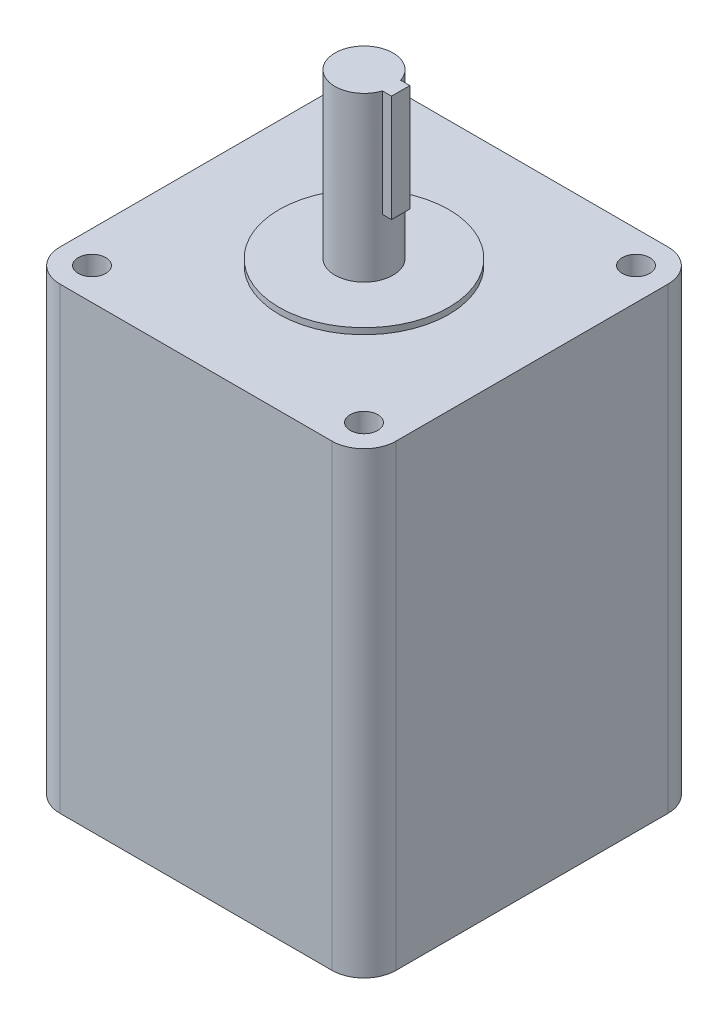
ISO-10303-21;
HEADER;
FILE_DESCRIPTION(('STEP AP214'),'2;1');
FILE_NAME('part.step','',(''),(''),'','','');
FILE_SCHEMA(('AUTOMOTIVE_DESIGN { 1 0 10303 214 1 1 1 1 }'));
ENDSEC;
DATA;
#1=APPLICATION_CONTEXT('core data for automotive mechanical design processes');
#2=APPLICATION_PROTOCOL_DEFINITION('international standard','automotive_design',2000,#1);
#3=PRODUCT_CONTEXT('',#1,'mechanical');
#4=PRODUCT('Part','Part','',(#3));
#5=PRODUCT_RELATED_PRODUCT_CATEGORY('part','',(#4));
#6=PRODUCT_DEFINITION_FORMATION('','',#4);
#7=PRODUCT_DEFINITION_CONTEXT('part definition',#1,'design');
#8=PRODUCT_DEFINITION('design','',#6,#7);
#9=PRODUCT_DEFINITION_SHAPE('','',#8);
#10=(LENGTH_UNIT() NAMED_UNIT(*) SI_UNIT(.MILLI.,.METRE.));
#11=(NAMED_UNIT(*) PLANE_ANGLE_UNIT() SI_UNIT($,.RADIAN.));
#12=(NAMED_UNIT(*) SI_UNIT($,.STERADIAN.) SOLID_ANGLE_UNIT());
#13=UNCERTAINTY_MEASURE_WITH_UNIT(LENGTH_MEASURE(1.E-05),#10,'distance_accuracy_value','');
#14=(GEOMETRIC_REPRESENTATION_CONTEXT(3) GLOBAL_UNCERTAINTY_ASSIGNED_CONTEXT((#13)) GLOBAL_UNIT_ASSIGNED_CONTEXT((#10,
#11,#12)) REPRESENTATION_CONTEXT('',''));
#15=CARTESIAN_POINT('',(0.,0.,0.));
#16=DIRECTION('',(0.,0.,1.));
#17=DIRECTION('',(1.,0.,0.));
#18=AXIS2_PLACEMENT_3D('',#15,#16,#17);
#19=CARTESIAN_POINT('',(0.,205.5,0.));
#20=DIRECTION('',(0.,-1.,0.));
#21=DIRECTION('',(0.,0.,-1.));
#22=AXIS2_PLACEMENT_3D('',#19,#20,#21);
#23=CYLINDRICAL_SURFACE('',#22,9.5);
#24=CARTESIAN_POINT('',(0.,152.,0.));
#25=DIRECTION('',(0.,1.,0.));
#26=DIRECTION('',(0.,0.,1.));
#27=AXIS2_PLACEMENT_3D('',#24,#25,#26);
#28=CIRCLE('',#27,9.5);
#29=CARTESIAN_POINT('',(0.,152.,9.5));
#30=VERTEX_POINT('',#29);
#31=EDGE_CURVE('E191',#30,#30,#28,.T.);
#32=ORIENTED_EDGE('',*,*,#31,.T.);
#33=EDGE_LOOP('',(#32));
#34=FACE_BOUND('',#33,.T.);
#35=DIRECTION('',(0.,-1.,0.));
#36=VECTOR('',#35,1.);
#37=CARTESIAN_POINT('',(9.01387818865997,205.5,3.));
#38=LINE('',#37,#36);
#39=CARTESIAN_POINT('',(9.01387818865997,205.5,3.));
#40=VERTEX_POINT('',#39);
#41=CARTESIAN_POINT('',(9.01387818865997,170.5,3.));
#42=VERTEX_POINT('',#41);
#43=EDGE_CURVE('E11',#40,#42,#38,.T.);
#44=ORIENTED_EDGE('',*,*,#43,.F.);
#45=CARTESIAN_POINT('',(0.,205.5,0.));
#46=DIRECTION('',(0.,1.,0.));
#47=DIRECTION('',(0.,0.,1.));
#48=AXIS2_PLACEMENT_3D('',#45,#46,#47);
#49=CIRCLE('',#48,9.5);
#50=CARTESIAN_POINT('',(9.01387818865997,205.5,-3.));
#51=VERTEX_POINT('',#50);
#52=EDGE_CURVE('E194',#51,#40,#49,.T.);
#53=ORIENTED_EDGE('',*,*,#52,.F.);
#54=DIRECTION('',(0.,-1.,0.));
#55=VECTOR('',#54,1.);
#56=CARTESIAN_POINT('',(9.01387818865997,205.5,-3.));
#57=LINE('',#56,#55);
#58=CARTESIAN_POINT('',(9.01387818865997,170.5,-3.));
#59=VERTEX_POINT('',#58);
#60=EDGE_CURVE('E190',#59,#51,#57,.F.);
#61=ORIENTED_EDGE('',*,*,#60,.F.);
#62=CARTESIAN_POINT('',(0.,170.5,0.));
#63=DIRECTION('',(0.,1.,0.));
#64=DIRECTION('',(0.,0.,1.));
#65=AXIS2_PLACEMENT_3D('',#62,#63,#64);
#66=CIRCLE('',#65,9.5);
#67=EDGE_CURVE('E53',#42,#59,#66,.T.);
#68=ORIENTED_EDGE('',*,*,#67,.F.);
#69=EDGE_LOOP('',(#44,#53,#61,#68));
#70=FACE_BOUND('',#69,.T.);
#71=ADVANCED_FACE('F45',(#34,#70),#23,.T.);
#72=CARTESIAN_POINT('',(-44.5,150.,-44.5));
#73=DIRECTION('',(0.,-1.,0.));
#74=DIRECTION('',(0.,0.,-1.));
#75=AXIS2_PLACEMENT_3D('',#72,#73,#74);
#76=CYLINDRICAL_SURFACE('',#75,10.5);
#77=CARTESIAN_POINT('',(-44.5,0.,-44.5));
#78=DIRECTION('',(0.,1.,0.));
#79=DIRECTION('',(0.,0.,1.));
#80=AXIS2_PLACEMENT_3D('',#77,#78,#79);
#81=CIRCLE('',#80,10.5);
#82=CARTESIAN_POINT('',(-44.5,0.,-55.));
#83=VERTEX_POINT('',#82);
#84=CARTESIAN_POINT('',(-55.,0.,-44.5));
#85=VERTEX_POINT('',#84);
#86=EDGE_CURVE('E157',#83,#85,#81,.T.);
#87=ORIENTED_EDGE('',*,*,#86,.T.);
#88=DIRECTION('',(0.,-1.,0.));
#89=VECTOR('',#88,1.);
#90=CARTESIAN_POINT('',(-55.,150.,-44.5));
#91=LINE('',#90,#89);
#92=CARTESIAN_POINT('',(-55.,150.,-44.5));
#93=VERTEX_POINT('',#92);
#94=EDGE_CURVE('E188',#93,#85,#91,.T.);
#95=ORIENTED_EDGE('',*,*,#94,.F.);
#96=CARTESIAN_POINT('',(-44.5,150.,-44.5));
#97=DIRECTION('',(0.,1.,0.));
#98=DIRECTION('',(0.,0.,1.));
#99=AXIS2_PLACEMENT_3D('',#96,#97,#98);
#100=CIRCLE('',#99,10.5);
#101=CARTESIAN_POINT('',(-44.5,150.,-55.));
#102=VERTEX_POINT('',#101);
#103=EDGE_CURVE('E178',#102,#93,#100,.T.);
#104=ORIENTED_EDGE('',*,*,#103,.F.);
#105=DIRECTION('',(0.,-1.,0.));
#106=VECTOR('',#105,1.);
#107=CARTESIAN_POINT('',(-44.5,150.,-55.));
#108=LINE('',#107,#106);
#109=EDGE_CURVE('E69',#102,#83,#108,.T.);
#110=ORIENTED_EDGE('',*,*,#109,.T.);
#111=EDGE_LOOP('',(#87,#95,#104,#110));
#112=FACE_BOUND('',#111,.T.);
#113=ADVANCED_FACE('F47',(#112),#76,.T.);
#114=CARTESIAN_POINT('',(-55.,150.,-44.5));
#115=DIRECTION('',(1.,0.,0.));
#116=DIRECTION('',(0.,0.,-1.));
#117=AXIS2_PLACEMENT_3D('',#114,#115,#116);
#118=PLANE('',#117);
#119=DIRECTION('',(0.,0.,1.));
#120=VECTOR('',#119,1.);
#121=CARTESIAN_POINT('',(-55.,0.,-44.5));
#122=LINE('',#121,#120);
#123=CARTESIAN_POINT('',(-55.,0.,44.5));
#124=VERTEX_POINT('',#123);
#125=EDGE_CURVE('E159',#85,#124,#122,.T.);
#126=ORIENTED_EDGE('',*,*,#125,.T.);
#127=DIRECTION('',(0.,-1.,0.));
#128=VECTOR('',#127,1.);
#129=CARTESIAN_POINT('',(-55.,150.,44.5));
#130=LINE('',#129,#128);
#131=CARTESIAN_POINT('',(-55.,150.,44.5));
#132=VERTEX_POINT('',#131);
#133=EDGE_CURVE('E186',#132,#124,#130,.T.);
#134=ORIENTED_EDGE('',*,*,#133,.F.);
#135=DIRECTION('',(0.,0.,1.));
#136=VECTOR('',#135,1.);
#137=CARTESIAN_POINT('',(-55.,150.,-44.5));
#138=LINE('',#137,#136);
#139=EDGE_CURVE('E109',#93,#132,#138,.T.);
#140=ORIENTED_EDGE('',*,*,#139,.F.);
#141=ORIENTED_EDGE('',*,*,#94,.T.);
#142=EDGE_LOOP('',(#126,#134,#140,#141));
#143=FACE_BOUND('',#142,.T.);
#144=ADVANCED_FACE('F266',(#143),#118,.F.);
#145=CARTESIAN_POINT('',(-44.5,150.,44.5));
#146=DIRECTION('',(0.,-1.,0.));
#147=DIRECTION('',(0.,0.,-1.));
#148=AXIS2_PLACEMENT_3D('',#145,#146,#147);
#149=CYLINDRICAL_SURFACE('',#148,10.5);
#150=CARTESIAN_POINT('',(-44.5,0.,44.5));
#151=DIRECTION('',(0.,-1.,0.));
#152=DIRECTION('',(0.,0.,-1.));
#153=AXIS2_PLACEMENT_3D('',#150,#151,#152);
#154=CIRCLE('',#153,10.5);
#155=CARTESIAN_POINT('',(-44.5,0.,55.));
#156=VERTEX_POINT('',#155);
#157=EDGE_CURVE('E163',#156,#124,#154,.T.);
#158=ORIENTED_EDGE('',*,*,#157,.F.);
#159=DIRECTION('',(0.,-1.,0.));
#160=VECTOR('',#159,1.);
#161=CARTESIAN_POINT('',(-44.5,150.,55.));
#162=LINE('',#161,#160);
#163=CARTESIAN_POINT('',(-44.5,150.,55.));
#164=VERTEX_POINT('',#163);
#165=EDGE_CURVE('E184',#164,#156,#162,.T.);
#166=ORIENTED_EDGE('',*,*,#165,.F.);
#167=CARTESIAN_POINT('',(-44.5,150.,44.5));
#168=DIRECTION('',(0.,-1.,0.));
#169=DIRECTION('',(0.,0.,-1.));
#170=AXIS2_PLACEMENT_3D('',#167,#168,#169);
#171=CIRCLE('',#170,10.5);
#172=EDGE_CURVE('E251',#164,#132,#171,.T.);
#173=ORIENTED_EDGE('',*,*,#172,.T.);
#174=ORIENTED_EDGE('',*,*,#133,.T.);
#175=EDGE_LOOP('',(#158,#166,#173,#174));
#176=FACE_BOUND('',#175,.T.);
#177=ADVANCED_FACE('F269',(#176),#149,.T.);
#178=CARTESIAN_POINT('',(-44.5,150.,55.));
#179=DIRECTION('',(0.,0.,-1.));
#180=DIRECTION('',(-1.,0.,0.));
#181=AXIS2_PLACEMENT_3D('',#178,#179,#180);
#182=PLANE('',#181);
#183=DIRECTION('',(1.,0.,0.));
#184=VECTOR('',#183,1.);
#185=CARTESIAN_POINT('',(-44.5,0.,55.));
#186=LINE('',#185,#184);
#187=CARTESIAN_POINT('',(44.5,0.,55.));
#188=VERTEX_POINT('',#187);
#189=EDGE_CURVE('E166',#156,#188,#186,.T.);
#190=ORIENTED_EDGE('',*,*,#189,.T.);
#191=DIRECTION('',(0.,-1.,0.));
#192=VECTOR('',#191,1.);
#193=CARTESIAN_POINT('',(44.5,150.,55.));
#194=LINE('',#193,#192);
#195=CARTESIAN_POINT('',(44.5,150.,55.));
#196=VERTEX_POINT('',#195);
#197=EDGE_CURVE('E182',#196,#188,#194,.T.);
#198=ORIENTED_EDGE('',*,*,#197,.F.);
#199=DIRECTION('',(1.,0.,0.));
#200=VECTOR('',#199,1.);
#201=CARTESIAN_POINT('',(-44.5,150.,55.));
#202=LINE('',#201,#200);
#203=EDGE_CURVE('E152',#164,#196,#202,.T.);
#204=ORIENTED_EDGE('',*,*,#203,.F.);
#205=ORIENTED_EDGE('',*,*,#165,.T.);
#206=EDGE_LOOP('',(#190,#198,#204,#205));
#207=FACE_BOUND('',#206,.T.);
#208=ADVANCED_FACE('F257',(#207),#182,.F.);
#209=CARTESIAN_POINT('',(44.5,150.,44.5));
#210=DIRECTION('',(0.,-1.,0.));
#211=DIRECTION('',(0.,0.,-1.));
#212=AXIS2_PLACEMENT_3D('',#209,#210,#211);
#213=CYLINDRICAL_SURFACE('',#212,10.5);
#214=CARTESIAN_POINT('',(44.5,0.,44.5));
#215=DIRECTION('',(0.,-1.,0.));
#216=DIRECTION('',(0.,0.,-1.));
#217=AXIS2_PLACEMENT_3D('',#214,#215,#216);
#218=CIRCLE('',#217,10.5);
#219=CARTESIAN_POINT('',(55.,0.,44.5));
#220=VERTEX_POINT('',#219);
#221=EDGE_CURVE('E169',#220,#188,#218,.T.);
#222=ORIENTED_EDGE('',*,*,#221,.F.);
#223=DIRECTION('',(0.,-1.,0.));
#224=VECTOR('',#223,1.);
#225=CARTESIAN_POINT('',(55.,150.,44.5));
#226=LINE('',#225,#224);
#227=CARTESIAN_POINT('',(55.,150.,44.5));
#228=VERTEX_POINT('',#227);
#229=EDGE_CURVE('E137',#228,#220,#226,.T.);
#230=ORIENTED_EDGE('',*,*,#229,.F.);
#231=CARTESIAN_POINT('',(44.5,150.,44.5));
#232=DIRECTION('',(0.,-1.,0.));
#233=DIRECTION('',(0.,0.,-1.));
#234=AXIS2_PLACEMENT_3D('',#231,#232,#233);
#235=CIRCLE('',#234,10.5);
#236=EDGE_CURVE('E150',#228,#196,#235,.T.);
#237=ORIENTED_EDGE('',*,*,#236,.T.);
#238=ORIENTED_EDGE('',*,*,#197,.T.);
#239=EDGE_LOOP('',(#222,#230,#237,#238));
#240=FACE_BOUND('',#239,.T.);
#241=ADVANCED_FACE('F261',(#240),#213,.T.);
#242=CARTESIAN_POINT('',(55.,150.,-44.5));
#243=DIRECTION('',(1.,0.,0.));
#244=DIRECTION('',(0.,0.,-1.));
#245=AXIS2_PLACEMENT_3D('',#242,#243,#244);
#246=PLANE('',#245);
#247=DIRECTION('',(0.,0.,1.));
#248=VECTOR('',#247,1.);
#249=CARTESIAN_POINT('',(55.,0.,-44.5));
#250=LINE('',#249,#248);
#251=CARTESIAN_POINT('',(55.,0.,-44.5));
#252=VERTEX_POINT('',#251);
#253=EDGE_CURVE('E133',#252,#220,#250,.T.);
#254=ORIENTED_EDGE('',*,*,#253,.F.);
#255=DIRECTION('',(0.,-1.,0.));
#256=VECTOR('',#255,1.);
#257=CARTESIAN_POINT('',(55.,150.,-44.5));
#258=LINE('',#257,#256);
#259=CARTESIAN_POINT('',(55.,150.,-44.5));
#260=VERTEX_POINT('',#259);
#261=EDGE_CURVE('E127',#260,#252,#258,.T.);
#262=ORIENTED_EDGE('',*,*,#261,.F.);
#263=DIRECTION('',(0.,0.,1.));
#264=VECTOR('',#263,1.);
#265=CARTESIAN_POINT('',(55.,150.,-44.5));
#266=LINE('',#265,#264);
#267=EDGE_CURVE('E131',#260,#228,#266,.T.);
#268=ORIENTED_EDGE('',*,*,#267,.T.);
#269=ORIENTED_EDGE('',*,*,#229,.T.);
#270=EDGE_LOOP('',(#254,#262,#268,#269));
#271=FACE_BOUND('',#270,.T.);
#272=ADVANCED_FACE('F129',(#271),#246,.T.);
#273=CARTESIAN_POINT('',(44.5,150.,-44.5));
#274=DIRECTION('',(0.,-1.,0.));
#275=DIRECTION('',(0.,0.,-1.));
#276=AXIS2_PLACEMENT_3D('',#273,#274,#275);
#277=CYLINDRICAL_SURFACE('',#276,10.5);
#278=CARTESIAN_POINT('',(44.5,0.,-44.5));
#279=DIRECTION('',(0.,1.,0.));
#280=DIRECTION('',(0.,0.,1.));
#281=AXIS2_PLACEMENT_3D('',#278,#279,#280);
#282=CIRCLE('',#281,10.5);
#283=CARTESIAN_POINT('',(44.5,0.,-55.));
#284=VERTEX_POINT('',#283);
#285=EDGE_CURVE('E173',#252,#284,#282,.T.);
#286=ORIENTED_EDGE('',*,*,#285,.T.);
#287=DIRECTION('',(0.,-1.,0.));
#288=VECTOR('',#287,1.);
#289=CARTESIAN_POINT('',(44.5,150.,-55.));
#290=LINE('',#289,#288);
#291=CARTESIAN_POINT('',(44.5,150.,-55.));
#292=VERTEX_POINT('',#291);
#293=EDGE_CURVE('E138',#292,#284,#290,.T.);
#294=ORIENTED_EDGE('',*,*,#293,.F.);
#295=CARTESIAN_POINT('',(44.5,150.,-44.5));
#296=DIRECTION('',(0.,1.,0.));
#297=DIRECTION('',(0.,0.,1.));
#298=AXIS2_PLACEMENT_3D('',#295,#296,#297);
#299=CIRCLE('',#298,10.5);
#300=EDGE_CURVE('E141',#260,#292,#299,.T.);
#301=ORIENTED_EDGE('',*,*,#300,.F.);
#302=ORIENTED_EDGE('',*,*,#261,.T.);
#303=EDGE_LOOP('',(#286,#294,#301,#302));
#304=FACE_BOUND('',#303,.T.);
#305=ADVANCED_FACE('F142',(#304),#277,.T.);
#306=CARTESIAN_POINT('',(-44.5,150.,-55.));
#307=DIRECTION('',(0.,0.,-1.));
#308=DIRECTION('',(-1.,0.,0.));
#309=AXIS2_PLACEMENT_3D('',#306,#307,#308);
#310=PLANE('',#309);
#311=DIRECTION('',(1.,0.,0.));
#312=VECTOR('',#311,1.);
#313=CARTESIAN_POINT('',(-44.5,0.,-55.));
#314=LINE('',#313,#312);
#315=EDGE_CURVE('E175',#83,#284,#314,.T.);
#316=ORIENTED_EDGE('',*,*,#315,.F.);
#317=ORIENTED_EDGE('',*,*,#109,.F.);
#318=DIRECTION('',(1.,0.,0.));
#319=VECTOR('',#318,1.);
#320=CARTESIAN_POINT('',(-44.5,150.,-55.));
#321=LINE('',#320,#319);
#322=EDGE_CURVE('E145',#102,#292,#321,.T.);
#323=ORIENTED_EDGE('',*,*,#322,.T.);
#324=ORIENTED_EDGE('',*,*,#293,.T.);
#325=EDGE_LOOP('',(#316,#317,#323,#324));
#326=FACE_BOUND('',#325,.T.);
#327=ADVANCED_FACE('F264',(#326),#310,.T.);
#328=CARTESIAN_POINT('',(-44.5,150.,-44.5));
#329=DIRECTION('',(0.,1.,0.));
#330=DIRECTION('',(0.,0.,1.));
#331=AXIS2_PLACEMENT_3D('',#328,#329,#330);
#332=PLANE('',#331);
#333=CARTESIAN_POINT('',(0.,150.,0.));
#334=DIRECTION('',(0.,1.,0.));
#335=DIRECTION('',(0.,0.,1.));
#336=AXIS2_PLACEMENT_3D('',#333,#334,#335);
#337=CIRCLE('',#336,27.75);
#338=CARTESIAN_POINT('',(0.,150.,27.75));
#339=VERTEX_POINT('',#338);
#340=EDGE_CURVE('E228',#339,#339,#337,.T.);
#341=ORIENTED_EDGE('',*,*,#340,.F.);
#342=EDGE_LOOP('',(#341));
#343=FACE_BOUND('',#342,.T.);
#344=CARTESIAN_POINT('',(-44.5,150.,44.5000000000001));
#345=DIRECTION('',(0.,1.,0.));
#346=DIRECTION('',(0.,0.,1.));
#347=AXIS2_PLACEMENT_3D('',#344,#345,#346);
#348=CIRCLE('',#347,4.5);
#349=CARTESIAN_POINT('',(-44.5,150.,49.0000000000001));
#350=VERTEX_POINT('',#349);
#351=EDGE_CURVE('E233',#350,#350,#348,.T.);
#352=ORIENTED_EDGE('',*,*,#351,.F.);
#353=EDGE_LOOP('',(#352));
#354=FACE_BOUND('',#353,.T.);
#355=CARTESIAN_POINT('',(44.5,150.,-44.5));
#356=DIRECTION('',(0.,1.,0.));
#357=DIRECTION('',(0.,0.,1.));
#358=AXIS2_PLACEMENT_3D('',#355,#356,#357);
#359=CIRCLE('',#358,4.5);
#360=CARTESIAN_POINT('',(44.5,150.,-40.));
#361=VERTEX_POINT('',#360);
#362=EDGE_CURVE('E240',#361,#361,#359,.T.);
#363=ORIENTED_EDGE('',*,*,#362,.F.);
#364=EDGE_LOOP('',(#363));
#365=FACE_BOUND('',#364,.T.);
#366=CARTESIAN_POINT('',(-44.5,150.,-44.5));
#367=DIRECTION('',(0.,1.,0.));
#368=DIRECTION('',(0.,0.,1.));
#369=AXIS2_PLACEMENT_3D('',#366,#367,#368);
#370=CIRCLE('',#369,4.5);
#371=CARTESIAN_POINT('',(-44.5,150.,-40.));
#372=VERTEX_POINT('',#371);
#373=EDGE_CURVE('E224',#372,#372,#370,.T.);
#374=ORIENTED_EDGE('',*,*,#373,.F.);
#375=EDGE_LOOP('',(#374));
#376=FACE_BOUND('',#375,.T.);
#377=CARTESIAN_POINT('',(44.5,150.,44.5));
#378=DIRECTION('',(0.,1.,0.));
#379=DIRECTION('',(0.,0.,1.));
#380=AXIS2_PLACEMENT_3D('',#377,#378,#379);
#381=CIRCLE('',#380,4.5);
#382=CARTESIAN_POINT('',(44.5,150.,49.));
#383=VERTEX_POINT('',#382);
#384=EDGE_CURVE('E236',#383,#383,#381,.T.);
#385=ORIENTED_EDGE('',*,*,#384,.F.);
#386=EDGE_LOOP('',(#385));
#387=FACE_BOUND('',#386,.T.);
#388=ORIENTED_EDGE('',*,*,#103,.T.);
#389=ORIENTED_EDGE('',*,*,#139,.T.);
#390=ORIENTED_EDGE('',*,*,#172,.F.);
#391=ORIENTED_EDGE('',*,*,#203,.T.);
#392=ORIENTED_EDGE('',*,*,#236,.F.);
#393=ORIENTED_EDGE('',*,*,#267,.F.);
#394=ORIENTED_EDGE('',*,*,#300,.T.);
#395=ORIENTED_EDGE('',*,*,#322,.F.);
#396=EDGE_LOOP('',(#388,#389,#390,#391,#392,#393,#394,#395));
#397=FACE_BOUND('',#396,.T.);
#398=ADVANCED_FACE('F148',(#343,#354,#365,#376,#387,#397),#332,.T.);
#399=CARTESIAN_POINT('',(-44.5,0.,-44.5));
#400=DIRECTION('',(0.,1.,0.));
#401=DIRECTION('',(0.,0.,1.));
#402=AXIS2_PLACEMENT_3D('',#399,#400,#401);
#403=PLANE('',#402);
#404=ORIENTED_EDGE('',*,*,#86,.F.);
#405=ORIENTED_EDGE('',*,*,#315,.T.);
#406=ORIENTED_EDGE('',*,*,#285,.F.);
#407=ORIENTED_EDGE('',*,*,#253,.T.);
#408=ORIENTED_EDGE('',*,*,#221,.T.);
#409=ORIENTED_EDGE('',*,*,#189,.F.);
#410=ORIENTED_EDGE('',*,*,#157,.T.);
#411=ORIENTED_EDGE('',*,*,#125,.F.);
#412=EDGE_LOOP('',(#404,#405,#406,#407,#408,#409,#410,#411));
#413=FACE_BOUND('',#412,.T.);
#414=ADVANCED_FACE('F263',(#413),#403,.F.);
#415=CARTESIAN_POINT('',(44.5,137.5,44.5));
#416=DIRECTION('',(0.,1.,0.));
#417=DIRECTION('',(0.,0.,1.));
#418=AXIS2_PLACEMENT_3D('',#415,#416,#417);
#419=CYLINDRICAL_SURFACE('',#418,4.5);
#420=CARTESIAN_POINT('',(44.5,137.5,44.5));
#421=DIRECTION('',(0.,1.,0.));
#422=DIRECTION('',(0.,0.,1.));
#423=AXIS2_PLACEMENT_3D('',#420,#421,#422);
#424=CIRCLE('',#423,4.5);
#425=CARTESIAN_POINT('',(44.5,137.5,49.));
#426=VERTEX_POINT('',#425);
#427=EDGE_CURVE('E160',#426,#426,#424,.T.);
#428=ORIENTED_EDGE('',*,*,#427,.F.);
#429=EDGE_LOOP('',(#428));
#430=FACE_BOUND('',#429,.T.);
#431=ORIENTED_EDGE('',*,*,#384,.T.);
#432=EDGE_LOOP('',(#431));
#433=FACE_BOUND('',#432,.T.);
#434=ADVANCED_FACE('F317',(#430,#433),#419,.F.);
#435=CARTESIAN_POINT('',(44.5,137.5,44.5));
#436=DIRECTION('',(0.,1.,0.));
#437=DIRECTION('',(0.,0.,1.));
#438=AXIS2_PLACEMENT_3D('',#435,#436,#437);
#439=PLANE('',#438);
#440=ORIENTED_EDGE('',*,*,#427,.T.);
#441=EDGE_LOOP('',(#440));
#442=FACE_BOUND('',#441,.T.);
#443=ADVANCED_FACE('F293',(#442),#439,.T.);
#444=CARTESIAN_POINT('',(-44.5,137.5,-44.5));
#445=DIRECTION('',(0.,1.,0.));
#446=DIRECTION('',(0.,0.,1.));
#447=AXIS2_PLACEMENT_3D('',#444,#445,#446);
#448=CYLINDRICAL_SURFACE('',#447,4.5);
#449=CARTESIAN_POINT('',(-44.5,137.5,-44.5));
#450=DIRECTION('',(0.,1.,0.));
#451=DIRECTION('',(0.,0.,1.));
#452=AXIS2_PLACEMENT_3D('',#449,#450,#451);
#453=CIRCLE('',#452,4.5);
#454=CARTESIAN_POINT('',(-44.5,137.5,-40.));
#455=VERTEX_POINT('',#454);
#456=EDGE_CURVE('E221',#455,#455,#453,.T.);
#457=ORIENTED_EDGE('',*,*,#456,.F.);
#458=EDGE_LOOP('',(#457));
#459=FACE_BOUND('',#458,.T.);
#460=ORIENTED_EDGE('',*,*,#373,.T.);
#461=EDGE_LOOP('',(#460));
#462=FACE_BOUND('',#461,.T.);
#463=ADVANCED_FACE('F289',(#459,#462),#448,.F.);
#464=CARTESIAN_POINT('',(-44.5,137.5,-44.5));
#465=DIRECTION('',(0.,1.,0.));
#466=DIRECTION('',(0.,0.,1.));
#467=AXIS2_PLACEMENT_3D('',#464,#465,#466);
#468=PLANE('',#467);
#469=ORIENTED_EDGE('',*,*,#456,.T.);
#470=EDGE_LOOP('',(#469));
#471=FACE_BOUND('',#470,.T.);
#472=ADVANCED_FACE('F292',(#471),#468,.T.);
#473=CARTESIAN_POINT('',(44.5,137.5,-44.5));
#474=DIRECTION('',(0.,1.,0.));
#475=DIRECTION('',(0.,0.,1.));
#476=AXIS2_PLACEMENT_3D('',#473,#474,#475);
#477=CYLINDRICAL_SURFACE('',#476,4.5);
#478=CARTESIAN_POINT('',(44.5,137.5,-44.5));
#479=DIRECTION('',(0.,1.,0.));
#480=DIRECTION('',(0.,0.,1.));
#481=AXIS2_PLACEMENT_3D('',#478,#479,#480);
#482=CIRCLE('',#481,4.5);
#483=CARTESIAN_POINT('',(44.5,137.5,-40.));
#484=VERTEX_POINT('',#483);
#485=EDGE_CURVE('E231',#484,#484,#482,.T.);
#486=ORIENTED_EDGE('',*,*,#485,.F.);
#487=EDGE_LOOP('',(#486));
#488=FACE_BOUND('',#487,.T.);
#489=ORIENTED_EDGE('',*,*,#362,.T.);
#490=EDGE_LOOP('',(#489));
#491=FACE_BOUND('',#490,.T.);
#492=ADVANCED_FACE('F297',(#488,#491),#477,.F.);
#493=CARTESIAN_POINT('',(44.5,137.5,-44.5));
#494=DIRECTION('',(0.,1.,0.));
#495=DIRECTION('',(0.,0.,1.));
#496=AXIS2_PLACEMENT_3D('',#493,#494,#495);
#497=PLANE('',#496);
#498=ORIENTED_EDGE('',*,*,#485,.T.);
#499=EDGE_LOOP('',(#498));
#500=FACE_BOUND('',#499,.T.);
#501=ADVANCED_FACE('F303',(#500),#497,.T.);
#502=CARTESIAN_POINT('',(-44.5,137.5,44.5000000000001));
#503=DIRECTION('',(0.,1.,0.));
#504=DIRECTION('',(0.,0.,1.));
#505=AXIS2_PLACEMENT_3D('',#502,#503,#504);
#506=CYLINDRICAL_SURFACE('',#505,4.5);
#507=CARTESIAN_POINT('',(-44.5,137.5,44.5000000000001));
#508=DIRECTION('',(0.,1.,0.));
#509=DIRECTION('',(0.,0.,1.));
#510=AXIS2_PLACEMENT_3D('',#507,#508,#509);
#511=CIRCLE('',#510,4.5);
#512=CARTESIAN_POINT('',(-44.5,137.5,49.0000000000001));
#513=VERTEX_POINT('',#512);
#514=EDGE_CURVE('E237',#513,#513,#511,.T.);
#515=ORIENTED_EDGE('',*,*,#514,.F.);
#516=EDGE_LOOP('',(#515));
#517=FACE_BOUND('',#516,.T.);
#518=ORIENTED_EDGE('',*,*,#351,.T.);
#519=EDGE_LOOP('',(#518));
#520=FACE_BOUND('',#519,.T.);
#521=ADVANCED_FACE('F299',(#517,#520),#506,.F.);
#522=CARTESIAN_POINT('',(-44.5,137.5,44.5000000000001));
#523=DIRECTION('',(0.,1.,0.));
#524=DIRECTION('',(0.,0.,1.));
#525=AXIS2_PLACEMENT_3D('',#522,#523,#524);
#526=PLANE('',#525);
#527=ORIENTED_EDGE('',*,*,#514,.T.);
#528=EDGE_LOOP('',(#527));
#529=FACE_BOUND('',#528,.T.);
#530=ADVANCED_FACE('F302',(#529),#526,.T.);
#531=CARTESIAN_POINT('',(0.,152.,0.));
#532=DIRECTION('',(0.,-1.,0.));
#533=DIRECTION('',(0.,0.,-1.));
#534=AXIS2_PLACEMENT_3D('',#531,#532,#533);
#535=CYLINDRICAL_SURFACE('',#534,27.75);
#536=CARTESIAN_POINT('',(0.,152.,0.));
#537=DIRECTION('',(0.,1.,0.));
#538=DIRECTION('',(0.,0.,1.));
#539=AXIS2_PLACEMENT_3D('',#536,#537,#538);
#540=CIRCLE('',#539,27.75);
#541=CARTESIAN_POINT('',(0.,152.,27.75));
#542=VERTEX_POINT('',#541);
#543=EDGE_CURVE('E195',#542,#542,#540,.T.);
#544=ORIENTED_EDGE('',*,*,#543,.F.);
#545=EDGE_LOOP('',(#544));
#546=FACE_BOUND('',#545,.T.);
#547=ORIENTED_EDGE('',*,*,#340,.T.);
#548=EDGE_LOOP('',(#547));
#549=FACE_BOUND('',#548,.T.);
#550=ADVANCED_FACE('F307',(#546,#549),#535,.T.);
#551=CARTESIAN_POINT('',(0.,152.,0.));
#552=DIRECTION('',(0.,1.,0.));
#553=DIRECTION('',(0.,0.,1.));
#554=AXIS2_PLACEMENT_3D('',#551,#552,#553);
#555=PLANE('',#554);
#556=ORIENTED_EDGE('',*,*,#31,.F.);
#557=EDGE_LOOP('',(#556));
#558=FACE_BOUND('',#557,.T.);
#559=ORIENTED_EDGE('',*,*,#543,.T.);
#560=EDGE_LOOP('',(#559));
#561=FACE_BOUND('',#560,.T.);
#562=ADVANCED_FACE('F410',(#558,#561),#555,.T.);
#563=CARTESIAN_POINT('',(0.,205.5,0.));
#564=DIRECTION('',(0.,1.,0.));
#565=DIRECTION('',(0.,0.,1.));
#566=AXIS2_PLACEMENT_3D('',#563,#564,#565);
#567=PLANE('',#566);
#568=DIRECTION('',(-1.,0.,0.));
#569=VECTOR('',#568,1.);
#570=CARTESIAN_POINT('',(12.,205.5,-3.));
#571=LINE('',#570,#569);
#572=CARTESIAN_POINT('',(12.,205.5,-3.));
#573=VERTEX_POINT('',#572);
#574=EDGE_CURVE('E60',#573,#51,#571,.T.);
#575=ORIENTED_EDGE('',*,*,#574,.T.);
#576=ORIENTED_EDGE('',*,*,#52,.T.);
#577=DIRECTION('',(-1.,0.,0.));
#578=VECTOR('',#577,1.);
#579=CARTESIAN_POINT('',(12.,205.5,3.));
#580=LINE('',#579,#578);
#581=CARTESIAN_POINT('',(12.,205.5,3.));
#582=VERTEX_POINT('',#581);
#583=EDGE_CURVE('E503',#582,#40,#580,.T.);
#584=ORIENTED_EDGE('',*,*,#583,.F.);
#585=DIRECTION('',(0.,0.,1.));
#586=VECTOR('',#585,1.);
#587=CARTESIAN_POINT('',(12.,205.5,3.));
#588=LINE('',#587,#586);
#589=EDGE_CURVE('E478',#573,#582,#588,.T.);
#590=ORIENTED_EDGE('',*,*,#589,.F.);
#591=EDGE_LOOP('',(#575,#576,#584,#590));
#592=FACE_BOUND('',#591,.T.);
#593=ADVANCED_FACE('F287',(#592),#567,.T.);
#594=CARTESIAN_POINT('',(12.,170.5,3.));
#595=DIRECTION('',(0.,0.,-1.));
#596=DIRECTION('',(-1.,0.,0.));
#597=AXIS2_PLACEMENT_3D('',#594,#595,#596);
#598=PLANE('',#597);
#599=ORIENTED_EDGE('',*,*,#583,.T.);
#600=ORIENTED_EDGE('',*,*,#43,.T.);
#601=DIRECTION('',(-1.,0.,0.));
#602=VECTOR('',#601,1.);
#603=CARTESIAN_POINT('',(12.,170.5,3.));
#604=LINE('',#603,#602);
#605=CARTESIAN_POINT('',(12.,170.5,3.));
#606=VERTEX_POINT('',#605);
#607=EDGE_CURVE('E209',#606,#42,#604,.T.);
#608=ORIENTED_EDGE('',*,*,#607,.F.);
#609=DIRECTION('',(0.,-1.,0.));
#610=VECTOR('',#609,1.);
#611=CARTESIAN_POINT('',(12.,170.5,3.));
#612=LINE('',#611,#610);
#613=EDGE_CURVE('E475',#582,#606,#612,.T.);
#614=ORIENTED_EDGE('',*,*,#613,.F.);
#615=EDGE_LOOP('',(#599,#600,#608,#614));
#616=FACE_BOUND('',#615,.T.);
#617=ADVANCED_FACE('F432',(#616),#598,.F.);
#618=CARTESIAN_POINT('',(12.,170.5,-3.));
#619=DIRECTION('',(0.,0.,1.));
#620=DIRECTION('',(1.,0.,0.));
#621=AXIS2_PLACEMENT_3D('',#618,#619,#620);
#622=PLANE('',#621);
#623=DIRECTION('',(-1.,0.,0.));
#624=VECTOR('',#623,1.);
#625=CARTESIAN_POINT('',(12.,170.5,-3.));
#626=LINE('',#625,#624);
#627=CARTESIAN_POINT('',(12.,170.5,-3.));
#628=VERTEX_POINT('',#627);
#629=EDGE_CURVE('E206',#628,#59,#626,.T.);
#630=ORIENTED_EDGE('',*,*,#629,.T.);
#631=ORIENTED_EDGE('',*,*,#60,.T.);
#632=ORIENTED_EDGE('',*,*,#574,.F.);
#633=DIRECTION('',(0.,1.,0.));
#634=VECTOR('',#633,1.);
#635=CARTESIAN_POINT('',(12.,170.5,-3.));
#636=LINE('',#635,#634);
#637=EDGE_CURVE('E218',#628,#573,#636,.T.);
#638=ORIENTED_EDGE('',*,*,#637,.F.);
#639=EDGE_LOOP('',(#630,#631,#632,#638));
#640=FACE_BOUND('',#639,.T.);
#641=ADVANCED_FACE('F215',(#640),#622,.F.);
#642=CARTESIAN_POINT('',(12.,170.5,-3.));
#643=DIRECTION('',(0.,1.,0.));
#644=DIRECTION('',(0.,0.,1.));
#645=AXIS2_PLACEMENT_3D('',#642,#643,#644);
#646=PLANE('',#645);
#647=ORIENTED_EDGE('',*,*,#607,.T.);
#648=ORIENTED_EDGE('',*,*,#67,.T.);
#649=ORIENTED_EDGE('',*,*,#629,.F.);
#650=DIRECTION('',(0.,0.,-1.));
#651=VECTOR('',#650,1.);
#652=CARTESIAN_POINT('',(12.,170.5,-3.));
#653=LINE('',#652,#651);
#654=EDGE_CURVE('E476',#606,#628,#653,.T.);
#655=ORIENTED_EDGE('',*,*,#654,.F.);
#656=EDGE_LOOP('',(#647,#648,#649,#655));
#657=FACE_BOUND('',#656,.T.);
#658=ADVANCED_FACE('F203',(#657),#646,.F.);
#659=CARTESIAN_POINT('',(12.,0.,0.));
#660=DIRECTION('',(-1.,0.,0.));
#661=DIRECTION('',(0.,0.,1.));
#662=AXIS2_PLACEMENT_3D('',#659,#660,#661);
#663=PLANE('',#662);
#664=ORIENTED_EDGE('',*,*,#613,.T.);
#665=ORIENTED_EDGE('',*,*,#654,.T.);
#666=ORIENTED_EDGE('',*,*,#637,.T.);
#667=ORIENTED_EDGE('',*,*,#589,.T.);
#668=EDGE_LOOP('',(#664,#665,#666,#667));
#669=FACE_BOUND('',#668,.T.);
#670=ADVANCED_FACE('F458',(#669),#663,.F.);
#671=CLOSED_SHELL('',(#71,#113,#144,#177,#208,#241,#272,#305,#327,#398,#414,#434,#443,#463,#472,
#492,#501,#521,#530,#550,#562,#593,#617,#641,#658,#670));
#672=MANIFOLD_SOLID_BREP('B2',#671);
#673=ADVANCED_BREP_SHAPE_REPRESENTATION('',(#18,#672),#14);
#674=SHAPE_DEFINITION_REPRESENTATION(#9,#673);
ENDSEC;
END-ISO-10303-21;
